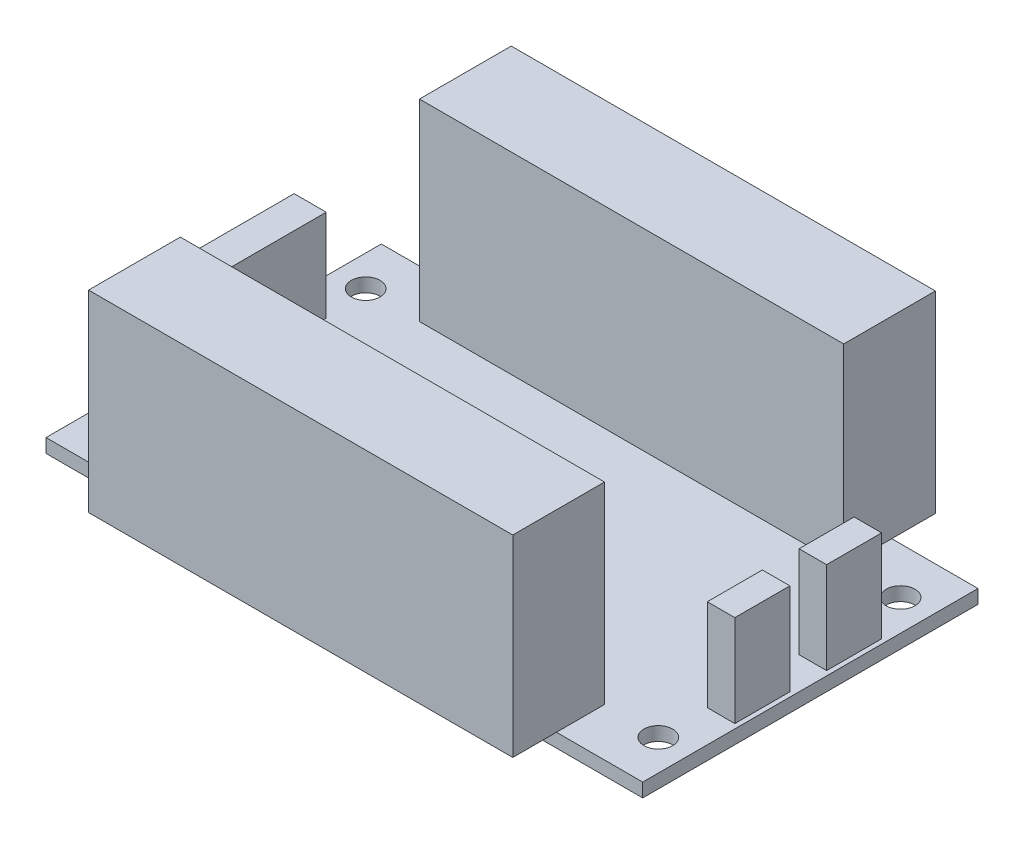
ISO-10303-21;
HEADER;
FILE_DESCRIPTION(('STEP AP214'),'2;1');
FILE_NAME('part.step','',(''),(''),'','','');
FILE_SCHEMA(('AUTOMOTIVE_DESIGN { 1 0 10303 214 1 1 1 1 }'));
ENDSEC;
DATA;
#1=APPLICATION_CONTEXT('core data for automotive mechanical design processes');
#2=APPLICATION_PROTOCOL_DEFINITION('international standard','automotive_design',2000,#1);
#3=PRODUCT_CONTEXT('',#1,'mechanical');
#4=PRODUCT('Part','Part','',(#3));
#5=PRODUCT_RELATED_PRODUCT_CATEGORY('part','',(#4));
#6=PRODUCT_DEFINITION_FORMATION('','',#4);
#7=PRODUCT_DEFINITION_CONTEXT('part definition',#1,'design');
#8=PRODUCT_DEFINITION('design','',#6,#7);
#9=PRODUCT_DEFINITION_SHAPE('','',#8);
#10=(LENGTH_UNIT() NAMED_UNIT(*) SI_UNIT(.MILLI.,.METRE.));
#11=(NAMED_UNIT(*) PLANE_ANGLE_UNIT() SI_UNIT($,.RADIAN.));
#12=(NAMED_UNIT(*) SI_UNIT($,.STERADIAN.) SOLID_ANGLE_UNIT());
#13=UNCERTAINTY_MEASURE_WITH_UNIT(LENGTH_MEASURE(1.E-05),#10,'distance_accuracy_value','');
#14=(GEOMETRIC_REPRESENTATION_CONTEXT(3) GLOBAL_UNCERTAINTY_ASSIGNED_CONTEXT((#13)) GLOBAL_UNIT_ASSIGNED_CONTEXT((#10,
#11,#12)) REPRESENTATION_CONTEXT('',''));
#15=CARTESIAN_POINT('',(0.,0.,0.));
#16=DIRECTION('',(0.,0.,1.));
#17=DIRECTION('',(1.,0.,0.));
#18=AXIS2_PLACEMENT_3D('',#15,#16,#17);
#19=CARTESIAN_POINT('',(0.,1.5,0.));
#20=DIRECTION('',(0.,-1.,0.));
#21=DIRECTION('',(0.,0.,-1.));
#22=AXIS2_PLACEMENT_3D('',#19,#20,#21);
#23=PLANE('',#22);
#24=DIRECTION('',(0.,0.,1.));
#25=VECTOR('',#24,1.);
#26=CARTESIAN_POINT('',(29.015,1.5,-8.27));
#27=LINE('',#26,#25);
#28=CARTESIAN_POINT('',(29.015,1.5,-8.27));
#29=VERTEX_POINT('',#28);
#30=CARTESIAN_POINT('',(29.015,1.5,-2.27));
#31=VERTEX_POINT('',#30);
#32=EDGE_CURVE('E300',#29,#31,#27,.T.);
#33=ORIENTED_EDGE('',*,*,#32,.F.);
#34=DIRECTION('',(-1.,0.,0.));
#35=VECTOR('',#34,1.);
#36=CARTESIAN_POINT('',(32.015,1.5,-8.27000000000008));
#37=LINE('',#36,#35);
#38=CARTESIAN_POINT('',(32.015,1.5,-8.27000000000008));
#39=VERTEX_POINT('',#38);
#40=EDGE_CURVE('E305',#39,#29,#37,.T.);
#41=ORIENTED_EDGE('',*,*,#40,.F.);
#42=DIRECTION('',(0.,0.,-1.));
#43=VECTOR('',#42,1.);
#44=CARTESIAN_POINT('',(32.015,1.5,-8.27000000000008));
#45=LINE('',#44,#43);
#46=CARTESIAN_POINT('',(32.015,1.5,-2.27000000000008));
#47=VERTEX_POINT('',#46);
#48=EDGE_CURVE('E317',#47,#39,#45,.T.);
#49=ORIENTED_EDGE('',*,*,#48,.F.);
#50=DIRECTION('',(1.,0.,0.));
#51=VECTOR('',#50,1.);
#52=CARTESIAN_POINT('',(32.015,1.5,-2.27000000000008));
#53=LINE('',#52,#51);
#54=EDGE_CURVE('E314',#31,#47,#53,.T.);
#55=ORIENTED_EDGE('',*,*,#54,.F.);
#56=EDGE_LOOP('',(#33,#41,#49,#55));
#57=FACE_BOUND('',#56,.T.);
#58=CARTESIAN_POINT('',(-29.145,1.5,13.2));
#59=DIRECTION('',(0.,1.,0.));
#60=DIRECTION('',(0.,0.,-1.));
#61=AXIS2_PLACEMENT_3D('',#58,#59,#60);
#62=CIRCLE('',#61,1.57);
#63=CARTESIAN_POINT('',(-29.145,1.5,11.63));
#64=VERTEX_POINT('',#63);
#65=EDGE_CURVE('E367',#64,#64,#62,.T.);
#66=ORIENTED_EDGE('',*,*,#65,.F.);
#67=EDGE_LOOP('',(#66));
#68=FACE_BOUND('',#67,.T.);
#69=CARTESIAN_POINT('',(29.145,1.5,13.2));
#70=DIRECTION('',(0.,1.,0.));
#71=DIRECTION('',(0.,0.,1.));
#72=AXIS2_PLACEMENT_3D('',#69,#70,#71);
#73=CIRCLE('',#72,1.57);
#74=CARTESIAN_POINT('',(29.145,1.5,14.77));
#75=VERTEX_POINT('',#74);
#76=EDGE_CURVE('E373',#75,#75,#73,.T.);
#77=ORIENTED_EDGE('',*,*,#76,.F.);
#78=EDGE_LOOP('',(#77));
#79=FACE_BOUND('',#78,.T.);
#80=CARTESIAN_POINT('',(29.145,1.5,-13.2));
#81=DIRECTION('',(0.,1.,0.));
#82=DIRECTION('',(0.,0.,-1.));
#83=AXIS2_PLACEMENT_3D('',#80,#81,#82);
#84=CIRCLE('',#83,1.57);
#85=CARTESIAN_POINT('',(29.145,1.5,-14.77));
#86=VERTEX_POINT('',#85);
#87=EDGE_CURVE('E379',#86,#86,#84,.T.);
#88=ORIENTED_EDGE('',*,*,#87,.F.);
#89=EDGE_LOOP('',(#88));
#90=FACE_BOUND('',#89,.T.);
#91=CARTESIAN_POINT('',(-29.145,1.5,-13.2));
#92=DIRECTION('',(0.,1.,0.));
#93=DIRECTION('',(0.,0.,1.));
#94=AXIS2_PLACEMENT_3D('',#91,#92,#93);
#95=CIRCLE('',#94,1.57);
#96=CARTESIAN_POINT('',(-29.145,1.5,-11.63));
#97=VERTEX_POINT('',#96);
#98=EDGE_CURVE('E385',#97,#97,#95,.T.);
#99=ORIENTED_EDGE('',*,*,#98,.F.);
#100=EDGE_LOOP('',(#99));
#101=FACE_BOUND('',#100,.T.);
#102=DIRECTION('',(-1.,0.,0.));
#103=VECTOR('',#102,1.);
#104=CARTESIAN_POINT('',(-32.015,1.5,-8.26999999999999));
#105=LINE('',#104,#103);
#106=CARTESIAN_POINT('',(-28.515,1.5,-8.27));
#107=VERTEX_POINT('',#106);
#108=CARTESIAN_POINT('',(-32.015,1.5,-8.26999999999999));
#109=VERTEX_POINT('',#108);
#110=EDGE_CURVE('E333',#107,#109,#105,.T.);
#111=ORIENTED_EDGE('',*,*,#110,.F.);
#112=DIRECTION('',(0.,0.,-1.));
#113=VECTOR('',#112,1.);
#114=CARTESIAN_POINT('',(-28.515,1.5,-8.27));
#115=LINE('',#114,#113);
#116=CARTESIAN_POINT('',(-28.515,1.5,7.73));
#117=VERTEX_POINT('',#116);
#118=EDGE_CURVE('E338',#117,#107,#115,.T.);
#119=ORIENTED_EDGE('',*,*,#118,.F.);
#120=DIRECTION('',(1.,0.,0.));
#121=VECTOR('',#120,1.);
#122=CARTESIAN_POINT('',(-28.515,1.5,7.73));
#123=LINE('',#122,#121);
#124=CARTESIAN_POINT('',(-32.015,1.5,7.73000000000001));
#125=VERTEX_POINT('',#124);
#126=EDGE_CURVE('E350',#125,#117,#123,.T.);
#127=ORIENTED_EDGE('',*,*,#126,.F.);
#128=DIRECTION('',(0.,0.,1.));
#129=VECTOR('',#128,1.);
#130=CARTESIAN_POINT('',(-32.015,1.5,7.73000000000001));
#131=LINE('',#130,#129);
#132=EDGE_CURVE('E347',#109,#125,#131,.T.);
#133=ORIENTED_EDGE('',*,*,#132,.F.);
#134=EDGE_LOOP('',(#111,#119,#127,#133));
#135=FACE_BOUND('',#134,.T.);
#136=DIRECTION('',(0.,0.,1.));
#137=VECTOR('',#136,1.);
#138=CARTESIAN_POINT('',(29.015,1.5,1.73));
#139=LINE('',#138,#137);
#140=CARTESIAN_POINT('',(29.015,1.5,1.73));
#141=VERTEX_POINT('',#140);
#142=CARTESIAN_POINT('',(29.015,1.5,7.73));
#143=VERTEX_POINT('',#142);
#144=EDGE_CURVE('E267',#141,#143,#139,.T.);
#145=ORIENTED_EDGE('',*,*,#144,.F.);
#146=DIRECTION('',(-1.,0.,0.));
#147=VECTOR('',#146,1.);
#148=CARTESIAN_POINT('',(32.015,1.5,1.73));
#149=LINE('',#148,#147);
#150=CARTESIAN_POINT('',(32.015,1.5,1.73));
#151=VERTEX_POINT('',#150);
#152=EDGE_CURVE('E272',#151,#141,#149,.T.);
#153=ORIENTED_EDGE('',*,*,#152,.F.);
#154=DIRECTION('',(0.,0.,-1.));
#155=VECTOR('',#154,1.);
#156=CARTESIAN_POINT('',(32.015,1.5,1.73));
#157=LINE('',#156,#155);
#158=CARTESIAN_POINT('',(32.015,1.5,7.73));
#159=VERTEX_POINT('',#158);
#160=EDGE_CURVE('E284',#159,#151,#157,.T.);
#161=ORIENTED_EDGE('',*,*,#160,.F.);
#162=DIRECTION('',(1.,0.,0.));
#163=VECTOR('',#162,1.);
#164=CARTESIAN_POINT('',(29.015,1.5,7.73));
#165=LINE('',#164,#163);
#166=EDGE_CURVE('E281',#143,#159,#165,.T.);
#167=ORIENTED_EDGE('',*,*,#166,.F.);
#168=EDGE_LOOP('',(#145,#153,#161,#167));
#169=FACE_BOUND('',#168,.T.);
#170=DIRECTION('',(0.,0.,-1.));
#171=VECTOR('',#170,1.);
#172=CARTESIAN_POINT('',(23.115,1.5,-13.0309360036888));
#173=LINE('',#172,#171);
#174=CARTESIAN_POINT('',(23.115,1.5,-13.0309360036888));
#175=VERTEX_POINT('',#174);
#176=CARTESIAN_POINT('',(23.115,1.5,-18.27));
#177=VERTEX_POINT('',#176);
#178=EDGE_CURVE('E48',#175,#177,#173,.T.);
#179=ORIENTED_EDGE('',*,*,#178,.F.);
#180=DIRECTION('',(1.,0.,0.));
#181=VECTOR('',#180,1.);
#182=CARTESIAN_POINT('',(-23.115,1.5,-13.0309360036888));
#183=LINE('',#182,#181);
#184=CARTESIAN_POINT('',(-23.115,1.5,-13.0309360036888));
#185=VERTEX_POINT('',#184);
#186=EDGE_CURVE('E53',#185,#175,#183,.T.);
#187=ORIENTED_EDGE('',*,*,#186,.F.);
#188=DIRECTION('',(0.,0.,1.));
#189=VECTOR('',#188,1.);
#190=CARTESIAN_POINT('',(-23.115,1.5,-13.0309360036888));
#191=LINE('',#190,#189);
#192=CARTESIAN_POINT('',(-23.115,1.5,-18.27));
#193=VERTEX_POINT('',#192);
#194=EDGE_CURVE('E500',#193,#185,#191,.T.);
#195=ORIENTED_EDGE('',*,*,#194,.F.);
#196=DIRECTION('',(-1.,0.,0.));
#197=VECTOR('',#196,1.);
#198=CARTESIAN_POINT('',(-32.515,1.5,-18.27));
#199=LINE('',#198,#197);
#200=CARTESIAN_POINT('',(-32.515,1.5,-18.27));
#201=VERTEX_POINT('',#200);
#202=EDGE_CURVE('E394',#193,#201,#199,.T.);
#203=ORIENTED_EDGE('',*,*,#202,.T.);
#204=DIRECTION('',(0.,0.,1.));
#205=VECTOR('',#204,1.);
#206=CARTESIAN_POINT('',(-32.515,1.5,18.27));
#207=LINE('',#206,#205);
#208=CARTESIAN_POINT('',(-32.515,1.5,18.27));
#209=VERTEX_POINT('',#208);
#210=EDGE_CURVE('E398',#201,#209,#207,.T.);
#211=ORIENTED_EDGE('',*,*,#210,.T.);
#212=DIRECTION('',(1.,0.,0.));
#213=VECTOR('',#212,1.);
#214=CARTESIAN_POINT('',(-32.515,1.5,18.27));
#215=LINE('',#214,#213);
#216=CARTESIAN_POINT('',(-23.115,1.5,18.27));
#217=VERTEX_POINT('',#216);
#218=EDGE_CURVE('E402',#209,#217,#215,.T.);
#219=ORIENTED_EDGE('',*,*,#218,.T.);
#220=DIRECTION('',(0.,0.,1.));
#221=VECTOR('',#220,1.);
#222=CARTESIAN_POINT('',(-23.115,1.5,13.0309360036888));
#223=LINE('',#222,#221);
#224=CARTESIAN_POINT('',(-23.115,1.5,13.0309360036888));
#225=VERTEX_POINT('',#224);
#226=EDGE_CURVE('E230',#225,#217,#223,.T.);
#227=ORIENTED_EDGE('',*,*,#226,.F.);
#228=DIRECTION('',(-1.,0.,0.));
#229=VECTOR('',#228,1.);
#230=CARTESIAN_POINT('',(-23.115,1.5,13.0309360036888));
#231=LINE('',#230,#229);
#232=CARTESIAN_POINT('',(23.115,1.5,13.0309360036888));
#233=VERTEX_POINT('',#232);
#234=EDGE_CURVE('E240',#233,#225,#231,.T.);
#235=ORIENTED_EDGE('',*,*,#234,.F.);
#236=DIRECTION('',(0.,0.,-1.));
#237=VECTOR('',#236,1.);
#238=CARTESIAN_POINT('',(23.115,1.5,13.0309360036888));
#239=LINE('',#238,#237);
#240=CARTESIAN_POINT('',(23.115,1.5,18.27));
#241=VERTEX_POINT('',#240);
#242=EDGE_CURVE('E250',#241,#233,#239,.T.);
#243=ORIENTED_EDGE('',*,*,#242,.F.);
#244=CARTESIAN_POINT('',(32.515,1.5,18.27));
#245=VERTEX_POINT('',#244);
#246=EDGE_CURVE('E401',#241,#245,#215,.T.);
#247=ORIENTED_EDGE('',*,*,#246,.T.);
#248=DIRECTION('',(0.,0.,-1.));
#249=VECTOR('',#248,1.);
#250=CARTESIAN_POINT('',(32.515,1.5,18.27));
#251=LINE('',#250,#249);
#252=CARTESIAN_POINT('',(32.515,1.5,-18.27));
#253=VERTEX_POINT('',#252);
#254=EDGE_CURVE('E391',#245,#253,#251,.T.);
#255=ORIENTED_EDGE('',*,*,#254,.T.);
#256=EDGE_CURVE('E396',#253,#177,#199,.T.);
#257=ORIENTED_EDGE('',*,*,#256,.T.);
#258=EDGE_LOOP('',(#179,#187,#195,#203,#211,#219,#227,#235,#243,#247,#255,#257));
#259=FACE_BOUND('',#258,.T.);
#260=ADVANCED_FACE('F33',(#57,#68,#79,#90,#101,#135,#169,#259),#23,.F.);
#261=CARTESIAN_POINT('',(0.,0.,0.));
#262=DIRECTION('',(0.,-1.,0.));
#263=DIRECTION('',(0.,0.,-1.));
#264=AXIS2_PLACEMENT_3D('',#261,#262,#263);
#265=PLANE('',#264);
#266=CARTESIAN_POINT('',(29.145,0.,13.2));
#267=DIRECTION('',(0.,1.,0.));
#268=DIRECTION('',(0.,0.,1.));
#269=AXIS2_PLACEMENT_3D('',#266,#267,#268);
#270=CIRCLE('',#269,1.57);
#271=CARTESIAN_POINT('',(29.145,0.,14.77));
#272=VERTEX_POINT('',#271);
#273=EDGE_CURVE('E370',#272,#272,#270,.T.);
#274=ORIENTED_EDGE('',*,*,#273,.T.);
#275=EDGE_LOOP('',(#274));
#276=FACE_BOUND('',#275,.T.);
#277=CARTESIAN_POINT('',(-29.145,0.,-13.2));
#278=DIRECTION('',(0.,1.,0.));
#279=DIRECTION('',(0.,0.,1.));
#280=AXIS2_PLACEMENT_3D('',#277,#278,#279);
#281=CIRCLE('',#280,1.57);
#282=CARTESIAN_POINT('',(-29.145,0.,-11.63));
#283=VERTEX_POINT('',#282);
#284=EDGE_CURVE('E382',#283,#283,#281,.T.);
#285=ORIENTED_EDGE('',*,*,#284,.T.);
#286=EDGE_LOOP('',(#285));
#287=FACE_BOUND('',#286,.T.);
#288=DIRECTION('',(0.,0.,-1.));
#289=VECTOR('',#288,1.);
#290=CARTESIAN_POINT('',(32.515,0.,18.27));
#291=LINE('',#290,#289);
#292=CARTESIAN_POINT('',(32.515,0.,18.27));
#293=VERTEX_POINT('',#292);
#294=CARTESIAN_POINT('',(32.515,0.,-18.27));
#295=VERTEX_POINT('',#294);
#296=EDGE_CURVE('E388',#293,#295,#291,.T.);
#297=ORIENTED_EDGE('',*,*,#296,.F.);
#298=DIRECTION('',(1.,0.,0.));
#299=VECTOR('',#298,1.);
#300=CARTESIAN_POINT('',(-32.515,0.,18.27));
#301=LINE('',#300,#299);
#302=CARTESIAN_POINT('',(-32.515,0.,18.27));
#303=VERTEX_POINT('',#302);
#304=EDGE_CURVE('E395',#303,#293,#301,.T.);
#305=ORIENTED_EDGE('',*,*,#304,.F.);
#306=DIRECTION('',(0.,0.,1.));
#307=VECTOR('',#306,1.);
#308=CARTESIAN_POINT('',(-32.515,0.,18.27));
#309=LINE('',#308,#307);
#310=CARTESIAN_POINT('',(-32.515,0.,-18.27));
#311=VERTEX_POINT('',#310);
#312=EDGE_CURVE('E411',#311,#303,#309,.T.);
#313=ORIENTED_EDGE('',*,*,#312,.F.);
#314=DIRECTION('',(-1.,0.,0.));
#315=VECTOR('',#314,1.);
#316=CARTESIAN_POINT('',(-32.515,0.,-18.27));
#317=LINE('',#316,#315);
#318=EDGE_CURVE('E409',#295,#311,#317,.T.);
#319=ORIENTED_EDGE('',*,*,#318,.F.);
#320=EDGE_LOOP('',(#297,#305,#313,#319));
#321=FACE_BOUND('',#320,.T.);
#322=CARTESIAN_POINT('',(29.145,0.,-13.2));
#323=DIRECTION('',(0.,1.,0.));
#324=DIRECTION('',(0.,0.,-1.));
#325=AXIS2_PLACEMENT_3D('',#322,#323,#324);
#326=CIRCLE('',#325,1.57);
#327=CARTESIAN_POINT('',(29.145,0.,-14.77));
#328=VERTEX_POINT('',#327);
#329=EDGE_CURVE('E376',#328,#328,#326,.T.);
#330=ORIENTED_EDGE('',*,*,#329,.T.);
#331=EDGE_LOOP('',(#330));
#332=FACE_BOUND('',#331,.T.);
#333=CARTESIAN_POINT('',(-29.145,0.,13.2));
#334=DIRECTION('',(0.,1.,0.));
#335=DIRECTION('',(0.,0.,-1.));
#336=AXIS2_PLACEMENT_3D('',#333,#334,#335);
#337=CIRCLE('',#336,1.57);
#338=CARTESIAN_POINT('',(-29.145,0.,11.63));
#339=VERTEX_POINT('',#338);
#340=EDGE_CURVE('E366',#339,#339,#337,.T.);
#341=ORIENTED_EDGE('',*,*,#340,.T.);
#342=EDGE_LOOP('',(#341));
#343=FACE_BOUND('',#342,.T.);
#344=ADVANCED_FACE('F429',(#276,#287,#321,#332,#343),#265,.T.);
#345=CARTESIAN_POINT('',(32.515,1.5,18.27));
#346=DIRECTION('',(-1.,0.,0.));
#347=DIRECTION('',(0.,0.,1.));
#348=AXIS2_PLACEMENT_3D('',#345,#346,#347);
#349=PLANE('',#348);
#350=ORIENTED_EDGE('',*,*,#296,.T.);
#351=DIRECTION('',(0.,-1.,0.));
#352=VECTOR('',#351,1.);
#353=CARTESIAN_POINT('',(32.515,1.5,-18.27));
#354=LINE('',#353,#352);
#355=EDGE_CURVE('E11',#253,#295,#354,.T.);
#356=ORIENTED_EDGE('',*,*,#355,.F.);
#357=ORIENTED_EDGE('',*,*,#254,.F.);
#358=DIRECTION('',(0.,-1.,0.));
#359=VECTOR('',#358,1.);
#360=CARTESIAN_POINT('',(32.515,1.5,18.27));
#361=LINE('',#360,#359);
#362=EDGE_CURVE('E405',#245,#293,#361,.T.);
#363=ORIENTED_EDGE('',*,*,#362,.T.);
#364=EDGE_LOOP('',(#350,#356,#357,#363));
#365=FACE_BOUND('',#364,.T.);
#366=ADVANCED_FACE('F35',(#365),#349,.F.);
#367=CARTESIAN_POINT('',(-32.515,1.5,-18.27));
#368=DIRECTION('',(0.,0.,1.));
#369=DIRECTION('',(1.,0.,0.));
#370=AXIS2_PLACEMENT_3D('',#367,#368,#369);
#371=PLANE('',#370);
#372=ORIENTED_EDGE('',*,*,#318,.T.);
#373=DIRECTION('',(0.,-1.,0.));
#374=VECTOR('',#373,1.);
#375=CARTESIAN_POINT('',(-32.515,1.5,-18.27));
#376=LINE('',#375,#374);
#377=EDGE_CURVE('E41',#201,#311,#376,.T.);
#378=ORIENTED_EDGE('',*,*,#377,.F.);
#379=ORIENTED_EDGE('',*,*,#202,.F.);
#380=EDGE_CURVE('E399',#177,#193,#199,.T.);
#381=ORIENTED_EDGE('',*,*,#380,.F.);
#382=ORIENTED_EDGE('',*,*,#256,.F.);
#383=ORIENTED_EDGE('',*,*,#355,.T.);
#384=EDGE_LOOP('',(#372,#378,#379,#381,#382,#383));
#385=FACE_BOUND('',#384,.T.);
#386=ADVANCED_FACE('F492',(#385),#371,.F.);
#387=CARTESIAN_POINT('',(-32.515,1.5,18.27));
#388=DIRECTION('',(1.,0.,0.));
#389=DIRECTION('',(0.,0.,-1.));
#390=AXIS2_PLACEMENT_3D('',#387,#388,#389);
#391=PLANE('',#390);
#392=ORIENTED_EDGE('',*,*,#312,.T.);
#393=DIRECTION('',(0.,-1.,0.));
#394=VECTOR('',#393,1.);
#395=CARTESIAN_POINT('',(-32.515,1.5,18.27));
#396=LINE('',#395,#394);
#397=EDGE_CURVE('E416',#209,#303,#396,.T.);
#398=ORIENTED_EDGE('',*,*,#397,.F.);
#399=ORIENTED_EDGE('',*,*,#210,.F.);
#400=ORIENTED_EDGE('',*,*,#377,.T.);
#401=EDGE_LOOP('',(#392,#398,#399,#400));
#402=FACE_BOUND('',#401,.T.);
#403=ADVANCED_FACE('F423',(#402),#391,.F.);
#404=CARTESIAN_POINT('',(-32.515,1.5,18.27));
#405=DIRECTION('',(0.,0.,-1.));
#406=DIRECTION('',(-1.,0.,0.));
#407=AXIS2_PLACEMENT_3D('',#404,#405,#406);
#408=PLANE('',#407);
#409=ORIENTED_EDGE('',*,*,#304,.T.);
#410=ORIENTED_EDGE('',*,*,#362,.F.);
#411=ORIENTED_EDGE('',*,*,#246,.F.);
#412=EDGE_CURVE('E406',#217,#241,#215,.T.);
#413=ORIENTED_EDGE('',*,*,#412,.F.);
#414=ORIENTED_EDGE('',*,*,#218,.F.);
#415=ORIENTED_EDGE('',*,*,#397,.T.);
#416=EDGE_LOOP('',(#409,#410,#411,#413,#414,#415));
#417=FACE_BOUND('',#416,.T.);
#418=ADVANCED_FACE('F433',(#417),#408,.F.);
#419=CARTESIAN_POINT('',(-29.145,1.5,-13.2));
#420=DIRECTION('',(0.,-1.,0.));
#421=DIRECTION('',(0.,0.,-1.));
#422=AXIS2_PLACEMENT_3D('',#419,#420,#421);
#423=CYLINDRICAL_SURFACE('',#422,1.57);
#424=ORIENTED_EDGE('',*,*,#98,.T.);
#425=EDGE_LOOP('',(#424));
#426=FACE_BOUND('',#425,.T.);
#427=ORIENTED_EDGE('',*,*,#284,.F.);
#428=EDGE_LOOP('',(#427));
#429=FACE_BOUND('',#428,.T.);
#430=ADVANCED_FACE('F486',(#426,#429),#423,.F.);
#431=CARTESIAN_POINT('',(29.145,1.5,-13.2));
#432=DIRECTION('',(0.,-1.,0.));
#433=DIRECTION('',(0.,0.,-1.));
#434=AXIS2_PLACEMENT_3D('',#431,#432,#433);
#435=CYLINDRICAL_SURFACE('',#434,1.57);
#436=ORIENTED_EDGE('',*,*,#87,.T.);
#437=EDGE_LOOP('',(#436));
#438=FACE_BOUND('',#437,.T.);
#439=ORIENTED_EDGE('',*,*,#329,.F.);
#440=EDGE_LOOP('',(#439));
#441=FACE_BOUND('',#440,.T.);
#442=ADVANCED_FACE('F755',(#438,#441),#435,.F.);
#443=CARTESIAN_POINT('',(29.145,1.5,13.2));
#444=DIRECTION('',(0.,-1.,0.));
#445=DIRECTION('',(0.,0.,-1.));
#446=AXIS2_PLACEMENT_3D('',#443,#444,#445);
#447=CYLINDRICAL_SURFACE('',#446,1.57);
#448=ORIENTED_EDGE('',*,*,#76,.T.);
#449=EDGE_LOOP('',(#448));
#450=FACE_BOUND('',#449,.T.);
#451=ORIENTED_EDGE('',*,*,#273,.F.);
#452=EDGE_LOOP('',(#451));
#453=FACE_BOUND('',#452,.T.);
#454=ADVANCED_FACE('F746',(#450,#453),#447,.F.);
#455=CARTESIAN_POINT('',(-29.145,1.5,13.2));
#456=DIRECTION('',(0.,-1.,0.));
#457=DIRECTION('',(0.,0.,-1.));
#458=AXIS2_PLACEMENT_3D('',#455,#456,#457);
#459=CYLINDRICAL_SURFACE('',#458,1.57);
#460=ORIENTED_EDGE('',*,*,#65,.T.);
#461=EDGE_LOOP('',(#460));
#462=FACE_BOUND('',#461,.T.);
#463=ORIENTED_EDGE('',*,*,#340,.F.);
#464=EDGE_LOOP('',(#463));
#465=FACE_BOUND('',#464,.T.);
#466=ADVANCED_FACE('F737',(#462,#465),#459,.F.);
#467=CARTESIAN_POINT('',(-32.015,11.5,-8.26999999999999));
#468=DIRECTION('',(0.,0.,1.));
#469=DIRECTION('',(1.,0.,0.));
#470=AXIS2_PLACEMENT_3D('',#467,#468,#469);
#471=PLANE('',#470);
#472=ORIENTED_EDGE('',*,*,#110,.T.);
#473=DIRECTION('',(0.,-1.,0.));
#474=VECTOR('',#473,1.);
#475=CARTESIAN_POINT('',(-32.015,11.5,-8.26999999999999));
#476=LINE('',#475,#474);
#477=CARTESIAN_POINT('',(-32.015,11.5,-8.26999999999999));
#478=VERTEX_POINT('',#477);
#479=EDGE_CURVE('E363',#478,#109,#476,.T.);
#480=ORIENTED_EDGE('',*,*,#479,.F.);
#481=DIRECTION('',(-1.,0.,0.));
#482=VECTOR('',#481,1.);
#483=CARTESIAN_POINT('',(-32.015,11.5,-8.26999999999999));
#484=LINE('',#483,#482);
#485=CARTESIAN_POINT('',(-28.515,11.5,-8.27));
#486=VERTEX_POINT('',#485);
#487=EDGE_CURVE('E334',#486,#478,#484,.T.);
#488=ORIENTED_EDGE('',*,*,#487,.F.);
#489=DIRECTION('',(0.,-1.,0.));
#490=VECTOR('',#489,1.);
#491=CARTESIAN_POINT('',(-28.515,11.5,-8.27));
#492=LINE('',#491,#490);
#493=EDGE_CURVE('E344',#486,#107,#492,.T.);
#494=ORIENTED_EDGE('',*,*,#493,.T.);
#495=EDGE_LOOP('',(#472,#480,#488,#494));
#496=FACE_BOUND('',#495,.T.);
#497=ADVANCED_FACE('F728',(#496),#471,.F.);
#498=CARTESIAN_POINT('',(-32.015,11.5,7.73000000000001));
#499=DIRECTION('',(1.,0.,0.));
#500=DIRECTION('',(0.,0.,-1.));
#501=AXIS2_PLACEMENT_3D('',#498,#499,#500);
#502=PLANE('',#501);
#503=ORIENTED_EDGE('',*,*,#132,.T.);
#504=DIRECTION('',(0.,-1.,0.));
#505=VECTOR('',#504,1.);
#506=CARTESIAN_POINT('',(-32.015,11.5,7.73000000000001));
#507=LINE('',#506,#505);
#508=CARTESIAN_POINT('',(-32.015,11.5,7.73000000000001));
#509=VERTEX_POINT('',#508);
#510=EDGE_CURVE('E360',#509,#125,#507,.T.);
#511=ORIENTED_EDGE('',*,*,#510,.F.);
#512=DIRECTION('',(0.,0.,1.));
#513=VECTOR('',#512,1.);
#514=CARTESIAN_POINT('',(-32.015,11.5,7.73000000000001));
#515=LINE('',#514,#513);
#516=EDGE_CURVE('E337',#478,#509,#515,.T.);
#517=ORIENTED_EDGE('',*,*,#516,.F.);
#518=ORIENTED_EDGE('',*,*,#479,.T.);
#519=EDGE_LOOP('',(#503,#511,#517,#518));
#520=FACE_BOUND('',#519,.T.);
#521=ADVANCED_FACE('F719',(#520),#502,.F.);
#522=CARTESIAN_POINT('',(-28.515,11.5,7.73));
#523=DIRECTION('',(0.,0.,-1.));
#524=DIRECTION('',(-1.,0.,0.));
#525=AXIS2_PLACEMENT_3D('',#522,#523,#524);
#526=PLANE('',#525);
#527=ORIENTED_EDGE('',*,*,#126,.T.);
#528=DIRECTION('',(0.,-1.,0.));
#529=VECTOR('',#528,1.);
#530=CARTESIAN_POINT('',(-28.515,11.5,7.73));
#531=LINE('',#530,#529);
#532=CARTESIAN_POINT('',(-28.515,11.5,7.73));
#533=VERTEX_POINT('',#532);
#534=EDGE_CURVE('E357',#533,#117,#531,.T.);
#535=ORIENTED_EDGE('',*,*,#534,.F.);
#536=DIRECTION('',(1.,0.,0.));
#537=VECTOR('',#536,1.);
#538=CARTESIAN_POINT('',(-28.515,11.5,7.73));
#539=LINE('',#538,#537);
#540=EDGE_CURVE('E340',#509,#533,#539,.T.);
#541=ORIENTED_EDGE('',*,*,#540,.F.);
#542=ORIENTED_EDGE('',*,*,#510,.T.);
#543=EDGE_LOOP('',(#527,#535,#541,#542));
#544=FACE_BOUND('',#543,.T.);
#545=ADVANCED_FACE('F710',(#544),#526,.F.);
#546=CARTESIAN_POINT('',(-28.515,11.5,-8.27));
#547=DIRECTION('',(-1.,0.,0.));
#548=DIRECTION('',(0.,0.,1.));
#549=AXIS2_PLACEMENT_3D('',#546,#547,#548);
#550=PLANE('',#549);
#551=ORIENTED_EDGE('',*,*,#118,.T.);
#552=ORIENTED_EDGE('',*,*,#493,.F.);
#553=DIRECTION('',(0.,0.,-1.));
#554=VECTOR('',#553,1.);
#555=CARTESIAN_POINT('',(-28.515,11.5,-8.27));
#556=LINE('',#555,#554);
#557=EDGE_CURVE('E342',#533,#486,#556,.T.);
#558=ORIENTED_EDGE('',*,*,#557,.F.);
#559=ORIENTED_EDGE('',*,*,#534,.T.);
#560=EDGE_LOOP('',(#551,#552,#558,#559));
#561=FACE_BOUND('',#560,.T.);
#562=ADVANCED_FACE('F701',(#561),#550,.F.);
#563=CARTESIAN_POINT('',(0.,11.5,0.));
#564=DIRECTION('',(0.,-1.,0.));
#565=DIRECTION('',(0.,0.,-1.));
#566=AXIS2_PLACEMENT_3D('',#563,#564,#565);
#567=PLANE('',#566);
#568=ORIENTED_EDGE('',*,*,#487,.T.);
#569=ORIENTED_EDGE('',*,*,#516,.T.);
#570=ORIENTED_EDGE('',*,*,#540,.T.);
#571=ORIENTED_EDGE('',*,*,#557,.T.);
#572=EDGE_LOOP('',(#568,#569,#570,#571));
#573=FACE_BOUND('',#572,.T.);
#574=ADVANCED_FACE('F692',(#573),#567,.F.);
#575=CARTESIAN_POINT('',(29.015,11.5,-8.27));
#576=DIRECTION('',(1.,0.,0.));
#577=DIRECTION('',(0.,0.,-1.));
#578=AXIS2_PLACEMENT_3D('',#575,#576,#577);
#579=PLANE('',#578);
#580=ORIENTED_EDGE('',*,*,#32,.T.);
#581=DIRECTION('',(0.,-1.,0.));
#582=VECTOR('',#581,1.);
#583=CARTESIAN_POINT('',(29.015,11.5,-2.27));
#584=LINE('',#583,#582);
#585=CARTESIAN_POINT('',(29.015,11.5,-2.27));
#586=VERTEX_POINT('',#585);
#587=EDGE_CURVE('E330',#586,#31,#584,.T.);
#588=ORIENTED_EDGE('',*,*,#587,.F.);
#589=DIRECTION('',(0.,0.,1.));
#590=VECTOR('',#589,1.);
#591=CARTESIAN_POINT('',(29.015,11.5,-8.27));
#592=LINE('',#591,#590);
#593=CARTESIAN_POINT('',(29.015,11.5,-8.27));
#594=VERTEX_POINT('',#593);
#595=EDGE_CURVE('E301',#594,#586,#592,.T.);
#596=ORIENTED_EDGE('',*,*,#595,.F.);
#597=DIRECTION('',(0.,-1.,0.));
#598=VECTOR('',#597,1.);
#599=CARTESIAN_POINT('',(29.015,11.5,-8.27));
#600=LINE('',#599,#598);
#601=EDGE_CURVE('E311',#594,#29,#600,.T.);
#602=ORIENTED_EDGE('',*,*,#601,.T.);
#603=EDGE_LOOP('',(#580,#588,#596,#602));
#604=FACE_BOUND('',#603,.T.);
#605=ADVANCED_FACE('F683',(#604),#579,.F.);
#606=CARTESIAN_POINT('',(32.015,11.5,-2.27000000000008));
#607=DIRECTION('',(0.,0.,-1.));
#608=DIRECTION('',(-1.,0.,0.));
#609=AXIS2_PLACEMENT_3D('',#606,#607,#608);
#610=PLANE('',#609);
#611=ORIENTED_EDGE('',*,*,#54,.T.);
#612=DIRECTION('',(0.,-1.,0.));
#613=VECTOR('',#612,1.);
#614=CARTESIAN_POINT('',(32.015,11.5,-2.27000000000008));
#615=LINE('',#614,#613);
#616=CARTESIAN_POINT('',(32.015,11.5,-2.27000000000008));
#617=VERTEX_POINT('',#616);
#618=EDGE_CURVE('E327',#617,#47,#615,.T.);
#619=ORIENTED_EDGE('',*,*,#618,.F.);
#620=DIRECTION('',(1.,0.,0.));
#621=VECTOR('',#620,1.);
#622=CARTESIAN_POINT('',(32.015,11.5,-2.27000000000008));
#623=LINE('',#622,#621);
#624=EDGE_CURVE('E304',#586,#617,#623,.T.);
#625=ORIENTED_EDGE('',*,*,#624,.F.);
#626=ORIENTED_EDGE('',*,*,#587,.T.);
#627=EDGE_LOOP('',(#611,#619,#625,#626));
#628=FACE_BOUND('',#627,.T.);
#629=ADVANCED_FACE('F674',(#628),#610,.F.);
#630=CARTESIAN_POINT('',(32.015,11.5,-8.27000000000008));
#631=DIRECTION('',(-1.,0.,0.));
#632=DIRECTION('',(0.,0.,1.));
#633=AXIS2_PLACEMENT_3D('',#630,#631,#632);
#634=PLANE('',#633);
#635=ORIENTED_EDGE('',*,*,#48,.T.);
#636=DIRECTION('',(0.,-1.,0.));
#637=VECTOR('',#636,1.);
#638=CARTESIAN_POINT('',(32.015,11.5,-8.27000000000008));
#639=LINE('',#638,#637);
#640=CARTESIAN_POINT('',(32.015,11.5,-8.27000000000008));
#641=VERTEX_POINT('',#640);
#642=EDGE_CURVE('E324',#641,#39,#639,.T.);
#643=ORIENTED_EDGE('',*,*,#642,.F.);
#644=DIRECTION('',(0.,0.,-1.));
#645=VECTOR('',#644,1.);
#646=CARTESIAN_POINT('',(32.015,11.5,-8.27000000000008));
#647=LINE('',#646,#645);
#648=EDGE_CURVE('E307',#617,#641,#647,.T.);
#649=ORIENTED_EDGE('',*,*,#648,.F.);
#650=ORIENTED_EDGE('',*,*,#618,.T.);
#651=EDGE_LOOP('',(#635,#643,#649,#650));
#652=FACE_BOUND('',#651,.T.);
#653=ADVANCED_FACE('F665',(#652),#634,.F.);
#654=CARTESIAN_POINT('',(32.015,11.5,-8.27000000000008));
#655=DIRECTION('',(0.,0.,1.));
#656=DIRECTION('',(1.,0.,0.));
#657=AXIS2_PLACEMENT_3D('',#654,#655,#656);
#658=PLANE('',#657);
#659=ORIENTED_EDGE('',*,*,#40,.T.);
#660=ORIENTED_EDGE('',*,*,#601,.F.);
#661=DIRECTION('',(-1.,0.,0.));
#662=VECTOR('',#661,1.);
#663=CARTESIAN_POINT('',(32.015,11.5,-8.27000000000008));
#664=LINE('',#663,#662);
#665=EDGE_CURVE('E309',#641,#594,#664,.T.);
#666=ORIENTED_EDGE('',*,*,#665,.F.);
#667=ORIENTED_EDGE('',*,*,#642,.T.);
#668=EDGE_LOOP('',(#659,#660,#666,#667));
#669=FACE_BOUND('',#668,.T.);
#670=ADVANCED_FACE('F656',(#669),#658,.F.);
#671=CARTESIAN_POINT('',(0.,11.5,0.));
#672=DIRECTION('',(0.,-1.,0.));
#673=DIRECTION('',(0.,0.,-1.));
#674=AXIS2_PLACEMENT_3D('',#671,#672,#673);
#675=PLANE('',#674);
#676=ORIENTED_EDGE('',*,*,#595,.T.);
#677=ORIENTED_EDGE('',*,*,#624,.T.);
#678=ORIENTED_EDGE('',*,*,#648,.T.);
#679=ORIENTED_EDGE('',*,*,#665,.T.);
#680=EDGE_LOOP('',(#676,#677,#678,#679));
#681=FACE_BOUND('',#680,.T.);
#682=ADVANCED_FACE('F647',(#681),#675,.F.);
#683=CARTESIAN_POINT('',(29.015,11.5,1.73));
#684=DIRECTION('',(1.,0.,0.));
#685=DIRECTION('',(0.,0.,-1.));
#686=AXIS2_PLACEMENT_3D('',#683,#684,#685);
#687=PLANE('',#686);
#688=ORIENTED_EDGE('',*,*,#144,.T.);
#689=DIRECTION('',(0.,-1.,0.));
#690=VECTOR('',#689,1.);
#691=CARTESIAN_POINT('',(29.015,11.5,7.73));
#692=LINE('',#691,#690);
#693=CARTESIAN_POINT('',(29.015,11.5,7.73));
#694=VERTEX_POINT('',#693);
#695=EDGE_CURVE('E297',#694,#143,#692,.T.);
#696=ORIENTED_EDGE('',*,*,#695,.F.);
#697=DIRECTION('',(0.,0.,1.));
#698=VECTOR('',#697,1.);
#699=CARTESIAN_POINT('',(29.015,11.5,1.73));
#700=LINE('',#699,#698);
#701=CARTESIAN_POINT('',(29.015,11.5,1.73));
#702=VERTEX_POINT('',#701);
#703=EDGE_CURVE('E268',#702,#694,#700,.T.);
#704=ORIENTED_EDGE('',*,*,#703,.F.);
#705=DIRECTION('',(0.,-1.,0.));
#706=VECTOR('',#705,1.);
#707=CARTESIAN_POINT('',(29.015,11.5,1.73));
#708=LINE('',#707,#706);
#709=EDGE_CURVE('E278',#702,#141,#708,.T.);
#710=ORIENTED_EDGE('',*,*,#709,.T.);
#711=EDGE_LOOP('',(#688,#696,#704,#710));
#712=FACE_BOUND('',#711,.T.);
#713=ADVANCED_FACE('F638',(#712),#687,.F.);
#714=CARTESIAN_POINT('',(29.015,11.5,7.73));
#715=DIRECTION('',(0.,0.,-1.));
#716=DIRECTION('',(-1.,0.,0.));
#717=AXIS2_PLACEMENT_3D('',#714,#715,#716);
#718=PLANE('',#717);
#719=ORIENTED_EDGE('',*,*,#166,.T.);
#720=DIRECTION('',(0.,-1.,0.));
#721=VECTOR('',#720,1.);
#722=CARTESIAN_POINT('',(32.015,11.5,7.73));
#723=LINE('',#722,#721);
#724=CARTESIAN_POINT('',(32.015,11.5,7.73));
#725=VERTEX_POINT('',#724);
#726=EDGE_CURVE('E294',#725,#159,#723,.T.);
#727=ORIENTED_EDGE('',*,*,#726,.F.);
#728=DIRECTION('',(1.,0.,0.));
#729=VECTOR('',#728,1.);
#730=CARTESIAN_POINT('',(29.015,11.5,7.73));
#731=LINE('',#730,#729);
#732=EDGE_CURVE('E271',#694,#725,#731,.T.);
#733=ORIENTED_EDGE('',*,*,#732,.F.);
#734=ORIENTED_EDGE('',*,*,#695,.T.);
#735=EDGE_LOOP('',(#719,#727,#733,#734));
#736=FACE_BOUND('',#735,.T.);
#737=ADVANCED_FACE('F629',(#736),#718,.F.);
#738=CARTESIAN_POINT('',(32.015,11.5,1.73));
#739=DIRECTION('',(-1.,0.,0.));
#740=DIRECTION('',(0.,0.,1.));
#741=AXIS2_PLACEMENT_3D('',#738,#739,#740);
#742=PLANE('',#741);
#743=ORIENTED_EDGE('',*,*,#160,.T.);
#744=DIRECTION('',(0.,-1.,0.));
#745=VECTOR('',#744,1.);
#746=CARTESIAN_POINT('',(32.015,11.5,1.73));
#747=LINE('',#746,#745);
#748=CARTESIAN_POINT('',(32.015,11.5,1.73));
#749=VERTEX_POINT('',#748);
#750=EDGE_CURVE('E291',#749,#151,#747,.T.);
#751=ORIENTED_EDGE('',*,*,#750,.F.);
#752=DIRECTION('',(0.,0.,-1.));
#753=VECTOR('',#752,1.);
#754=CARTESIAN_POINT('',(32.015,11.5,1.73));
#755=LINE('',#754,#753);
#756=EDGE_CURVE('E274',#725,#749,#755,.T.);
#757=ORIENTED_EDGE('',*,*,#756,.F.);
#758=ORIENTED_EDGE('',*,*,#726,.T.);
#759=EDGE_LOOP('',(#743,#751,#757,#758));
#760=FACE_BOUND('',#759,.T.);
#761=ADVANCED_FACE('F620',(#760),#742,.F.);
#762=CARTESIAN_POINT('',(32.015,11.5,1.73));
#763=DIRECTION('',(0.,0.,1.));
#764=DIRECTION('',(1.,0.,0.));
#765=AXIS2_PLACEMENT_3D('',#762,#763,#764);
#766=PLANE('',#765);
#767=ORIENTED_EDGE('',*,*,#152,.T.);
#768=ORIENTED_EDGE('',*,*,#709,.F.);
#769=DIRECTION('',(-1.,0.,0.));
#770=VECTOR('',#769,1.);
#771=CARTESIAN_POINT('',(32.015,11.5,1.73));
#772=LINE('',#771,#770);
#773=EDGE_CURVE('E276',#749,#702,#772,.T.);
#774=ORIENTED_EDGE('',*,*,#773,.F.);
#775=ORIENTED_EDGE('',*,*,#750,.T.);
#776=EDGE_LOOP('',(#767,#768,#774,#775));
#777=FACE_BOUND('',#776,.T.);
#778=ADVANCED_FACE('F611',(#777),#766,.F.);
#779=CARTESIAN_POINT('',(0.,11.5,0.));
#780=DIRECTION('',(0.,1.,0.));
#781=DIRECTION('',(0.,0.,1.));
#782=AXIS2_PLACEMENT_3D('',#779,#780,#781);
#783=PLANE('',#782);
#784=ORIENTED_EDGE('',*,*,#703,.T.);
#785=ORIENTED_EDGE('',*,*,#732,.T.);
#786=ORIENTED_EDGE('',*,*,#756,.T.);
#787=ORIENTED_EDGE('',*,*,#773,.T.);
#788=EDGE_LOOP('',(#784,#785,#786,#787));
#789=FACE_BOUND('',#788,.T.);
#790=ADVANCED_FACE('F599',(#789),#783,.T.);
#791=CARTESIAN_POINT('',(0.,1.5,0.));
#792=DIRECTION('',(0.,1.,0.));
#793=DIRECTION('',(0.,0.,1.));
#794=AXIS2_PLACEMENT_3D('',#791,#792,#793);
#795=PLANE('',#794);
#796=CARTESIAN_POINT('',(-23.115,1.5,23.0309360036888));
#797=VERTEX_POINT('',#796);
#798=EDGE_CURVE('E228',#217,#797,#223,.T.);
#799=ORIENTED_EDGE('',*,*,#798,.F.);
#800=ORIENTED_EDGE('',*,*,#412,.T.);
#801=CARTESIAN_POINT('',(23.115,1.5,23.0309360036888));
#802=VERTEX_POINT('',#801);
#803=EDGE_CURVE('E251',#802,#241,#239,.T.);
#804=ORIENTED_EDGE('',*,*,#803,.F.);
#805=DIRECTION('',(1.,0.,0.));
#806=VECTOR('',#805,1.);
#807=CARTESIAN_POINT('',(-23.115,1.5,23.0309360036888));
#808=LINE('',#807,#806);
#809=EDGE_CURVE('E248',#797,#802,#808,.T.);
#810=ORIENTED_EDGE('',*,*,#809,.F.);
#811=EDGE_LOOP('',(#799,#800,#804,#810));
#812=FACE_BOUND('',#811,.T.);
#813=ADVANCED_FACE('F445',(#812),#795,.F.);
#814=CARTESIAN_POINT('',(-23.115,22.5,13.0309360036888));
#815=DIRECTION('',(1.,0.,0.));
#816=DIRECTION('',(0.,0.,-1.));
#817=AXIS2_PLACEMENT_3D('',#814,#815,#816);
#818=PLANE('',#817);
#819=ORIENTED_EDGE('',*,*,#226,.T.);
#820=ORIENTED_EDGE('',*,*,#798,.T.);
#821=DIRECTION('',(0.,-1.,0.));
#822=VECTOR('',#821,1.);
#823=CARTESIAN_POINT('',(-23.115,22.5,23.0309360036888));
#824=LINE('',#823,#822);
#825=CARTESIAN_POINT('',(-23.115,22.5,23.0309360036888));
#826=VERTEX_POINT('',#825);
#827=EDGE_CURVE('E264',#826,#797,#824,.T.);
#828=ORIENTED_EDGE('',*,*,#827,.F.);
#829=DIRECTION('',(0.,0.,1.));
#830=VECTOR('',#829,1.);
#831=CARTESIAN_POINT('',(-23.115,22.5,13.0309360036888));
#832=LINE('',#831,#830);
#833=CARTESIAN_POINT('',(-23.115,22.5,13.0309360036888));
#834=VERTEX_POINT('',#833);
#835=EDGE_CURVE('E236',#834,#826,#832,.T.);
#836=ORIENTED_EDGE('',*,*,#835,.F.);
#837=DIRECTION('',(0.,-1.,0.));
#838=VECTOR('',#837,1.);
#839=CARTESIAN_POINT('',(-23.115,22.5,13.0309360036888));
#840=LINE('',#839,#838);
#841=EDGE_CURVE('E245',#834,#225,#840,.T.);
#842=ORIENTED_EDGE('',*,*,#841,.T.);
#843=EDGE_LOOP('',(#819,#820,#828,#836,#842));
#844=FACE_BOUND('',#843,.T.);
#845=ADVANCED_FACE('F457',(#844),#818,.F.);
#846=CARTESIAN_POINT('',(-23.115,22.5,23.0309360036888));
#847=DIRECTION('',(0.,0.,-1.));
#848=DIRECTION('',(-1.,0.,0.));
#849=AXIS2_PLACEMENT_3D('',#846,#847,#848);
#850=PLANE('',#849);
#851=ORIENTED_EDGE('',*,*,#809,.T.);
#852=DIRECTION('',(0.,-1.,0.));
#853=VECTOR('',#852,1.);
#854=CARTESIAN_POINT('',(23.115,22.5,23.0309360036888));
#855=LINE('',#854,#853);
#856=CARTESIAN_POINT('',(23.115,22.5,23.0309360036888));
#857=VERTEX_POINT('',#856);
#858=EDGE_CURVE('E261',#857,#802,#855,.T.);
#859=ORIENTED_EDGE('',*,*,#858,.F.);
#860=DIRECTION('',(1.,0.,0.));
#861=VECTOR('',#860,1.);
#862=CARTESIAN_POINT('',(-23.115,22.5,23.0309360036888));
#863=LINE('',#862,#861);
#864=EDGE_CURVE('E239',#826,#857,#863,.T.);
#865=ORIENTED_EDGE('',*,*,#864,.F.);
#866=ORIENTED_EDGE('',*,*,#827,.T.);
#867=EDGE_LOOP('',(#851,#859,#865,#866));
#868=FACE_BOUND('',#867,.T.);
#869=ADVANCED_FACE('F453',(#868),#850,.F.);
#870=CARTESIAN_POINT('',(23.115,22.5,13.0309360036888));
#871=DIRECTION('',(-1.,0.,0.));
#872=DIRECTION('',(0.,0.,1.));
#873=AXIS2_PLACEMENT_3D('',#870,#871,#872);
#874=PLANE('',#873);
#875=ORIENTED_EDGE('',*,*,#803,.T.);
#876=ORIENTED_EDGE('',*,*,#242,.T.);
#877=DIRECTION('',(0.,-1.,0.));
#878=VECTOR('',#877,1.);
#879=CARTESIAN_POINT('',(23.115,22.5,13.0309360036888));
#880=LINE('',#879,#878);
#881=CARTESIAN_POINT('',(23.115,22.5,13.0309360036888));
#882=VERTEX_POINT('',#881);
#883=EDGE_CURVE('E258',#882,#233,#880,.T.);
#884=ORIENTED_EDGE('',*,*,#883,.F.);
#885=DIRECTION('',(0.,0.,-1.));
#886=VECTOR('',#885,1.);
#887=CARTESIAN_POINT('',(23.115,22.5,13.0309360036888));
#888=LINE('',#887,#886);
#889=EDGE_CURVE('E242',#857,#882,#888,.T.);
#890=ORIENTED_EDGE('',*,*,#889,.F.);
#891=ORIENTED_EDGE('',*,*,#858,.T.);
#892=EDGE_LOOP('',(#875,#876,#884,#890,#891));
#893=FACE_BOUND('',#892,.T.);
#894=ADVANCED_FACE('F448',(#893),#874,.F.);
#895=CARTESIAN_POINT('',(-23.115,22.5,13.0309360036888));
#896=DIRECTION('',(0.,0.,1.));
#897=DIRECTION('',(1.,0.,0.));
#898=AXIS2_PLACEMENT_3D('',#895,#896,#897);
#899=PLANE('',#898);
#900=ORIENTED_EDGE('',*,*,#234,.T.);
#901=ORIENTED_EDGE('',*,*,#841,.F.);
#902=DIRECTION('',(-1.,0.,0.));
#903=VECTOR('',#902,1.);
#904=CARTESIAN_POINT('',(-23.115,22.5,13.0309360036888));
#905=LINE('',#904,#903);
#906=EDGE_CURVE('E244',#882,#834,#905,.T.);
#907=ORIENTED_EDGE('',*,*,#906,.F.);
#908=ORIENTED_EDGE('',*,*,#883,.T.);
#909=EDGE_LOOP('',(#900,#901,#907,#908));
#910=FACE_BOUND('',#909,.T.);
#911=ADVANCED_FACE('F460',(#910),#899,.F.);
#912=CARTESIAN_POINT('',(0.,22.5,0.));
#913=DIRECTION('',(0.,1.,0.));
#914=DIRECTION('',(0.,0.,1.));
#915=AXIS2_PLACEMENT_3D('',#912,#913,#914);
#916=PLANE('',#915);
#917=ORIENTED_EDGE('',*,*,#835,.T.);
#918=ORIENTED_EDGE('',*,*,#864,.T.);
#919=ORIENTED_EDGE('',*,*,#889,.T.);
#920=ORIENTED_EDGE('',*,*,#906,.T.);
#921=EDGE_LOOP('',(#917,#918,#919,#920));
#922=FACE_BOUND('',#921,.T.);
#923=ADVANCED_FACE('F463',(#922),#916,.T.);
#924=CARTESIAN_POINT('',(0.,1.5,0.));
#925=DIRECTION('',(0.,1.,0.));
#926=DIRECTION('',(0.,0.,1.));
#927=AXIS2_PLACEMENT_3D('',#924,#925,#926);
#928=PLANE('',#927);
#929=CARTESIAN_POINT('',(23.115,1.5,-23.0309360036888));
#930=VERTEX_POINT('',#929);
#931=EDGE_CURVE('E513',#177,#930,#173,.T.);
#932=ORIENTED_EDGE('',*,*,#931,.F.);
#933=ORIENTED_EDGE('',*,*,#380,.T.);
#934=CARTESIAN_POINT('',(-23.115,1.5,-23.0309360036888));
#935=VERTEX_POINT('',#934);
#936=EDGE_CURVE('E225',#935,#193,#191,.T.);
#937=ORIENTED_EDGE('',*,*,#936,.F.);
#938=DIRECTION('',(-1.,0.,0.));
#939=VECTOR('',#938,1.);
#940=CARTESIAN_POINT('',(-23.115,1.5,-23.0309360036888));
#941=LINE('',#940,#939);
#942=EDGE_CURVE('E502',#930,#935,#941,.T.);
#943=ORIENTED_EDGE('',*,*,#942,.F.);
#944=EDGE_LOOP('',(#932,#933,#937,#943));
#945=FACE_BOUND('',#944,.T.);
#946=ADVANCED_FACE('F465',(#945),#928,.F.);
#947=CARTESIAN_POINT('',(-23.115,22.5,-13.0309360036888));
#948=DIRECTION('',(0.,0.,-1.));
#949=DIRECTION('',(-1.,0.,0.));
#950=AXIS2_PLACEMENT_3D('',#947,#948,#949);
#951=PLANE('',#950);
#952=ORIENTED_EDGE('',*,*,#186,.T.);
#953=DIRECTION('',(0.,-1.,0.));
#954=VECTOR('',#953,1.);
#955=CARTESIAN_POINT('',(23.115,22.5,-13.0309360036888));
#956=LINE('',#955,#954);
#957=CARTESIAN_POINT('',(23.115,22.5,-13.0309360036888));
#958=VERTEX_POINT('',#957);
#959=EDGE_CURVE('E210',#958,#175,#956,.T.);
#960=ORIENTED_EDGE('',*,*,#959,.F.);
#961=DIRECTION('',(1.,0.,0.));
#962=VECTOR('',#961,1.);
#963=CARTESIAN_POINT('',(-23.115,22.5,-13.0309360036888));
#964=LINE('',#963,#962);
#965=CARTESIAN_POINT('',(-23.115,22.5,-13.0309360036888));
#966=VERTEX_POINT('',#965);
#967=EDGE_CURVE('E216',#966,#958,#964,.T.);
#968=ORIENTED_EDGE('',*,*,#967,.F.);
#969=DIRECTION('',(0.,-1.,0.));
#970=VECTOR('',#969,1.);
#971=CARTESIAN_POINT('',(-23.115,22.5,-13.0309360036888));
#972=LINE('',#971,#970);
#973=EDGE_CURVE('E507',#966,#185,#972,.T.);
#974=ORIENTED_EDGE('',*,*,#973,.T.);
#975=EDGE_LOOP('',(#952,#960,#968,#974));
#976=FACE_BOUND('',#975,.T.);
#977=ADVANCED_FACE('F227',(#976),#951,.F.);
#978=CARTESIAN_POINT('',(23.115,22.5,-13.0309360036888));
#979=DIRECTION('',(-1.,0.,0.));
#980=DIRECTION('',(0.,0.,1.));
#981=AXIS2_PLACEMENT_3D('',#978,#979,#980);
#982=PLANE('',#981);
#983=ORIENTED_EDGE('',*,*,#178,.T.);
#984=ORIENTED_EDGE('',*,*,#931,.T.);
#985=DIRECTION('',(0.,-1.,0.));
#986=VECTOR('',#985,1.);
#987=CARTESIAN_POINT('',(23.115,22.5,-23.0309360036888));
#988=LINE('',#987,#986);
#989=CARTESIAN_POINT('',(23.115,22.5,-23.0309360036888));
#990=VERTEX_POINT('',#989);
#991=EDGE_CURVE('E212',#990,#930,#988,.T.);
#992=ORIENTED_EDGE('',*,*,#991,.F.);
#993=DIRECTION('',(0.,0.,-1.));
#994=VECTOR('',#993,1.);
#995=CARTESIAN_POINT('',(23.115,22.5,-13.0309360036888));
#996=LINE('',#995,#994);
#997=EDGE_CURVE('E206',#958,#990,#996,.T.);
#998=ORIENTED_EDGE('',*,*,#997,.F.);
#999=ORIENTED_EDGE('',*,*,#959,.T.);
#1000=EDGE_LOOP('',(#983,#984,#992,#998,#999));
#1001=FACE_BOUND('',#1000,.T.);
#1002=ADVANCED_FACE('F208',(#1001),#982,.F.);
#1003=CARTESIAN_POINT('',(-23.115,22.5,-23.0309360036888));
#1004=DIRECTION('',(0.,0.,1.));
#1005=DIRECTION('',(1.,0.,0.));
#1006=AXIS2_PLACEMENT_3D('',#1003,#1004,#1005);
#1007=PLANE('',#1006);
#1008=ORIENTED_EDGE('',*,*,#942,.T.);
#1009=DIRECTION('',(0.,-1.,0.));
#1010=VECTOR('',#1009,1.);
#1011=CARTESIAN_POINT('',(-23.115,22.5,-23.0309360036888));
#1012=LINE('',#1011,#1010);
#1013=CARTESIAN_POINT('',(-23.115,22.5,-23.0309360036888));
#1014=VERTEX_POINT('',#1013);
#1015=EDGE_CURVE('E232',#1014,#935,#1012,.T.);
#1016=ORIENTED_EDGE('',*,*,#1015,.F.);
#1017=DIRECTION('',(-1.,0.,0.));
#1018=VECTOR('',#1017,1.);
#1019=CARTESIAN_POINT('',(-23.115,22.5,-23.0309360036888));
#1020=LINE('',#1019,#1018);
#1021=EDGE_CURVE('E215',#990,#1014,#1020,.T.);
#1022=ORIENTED_EDGE('',*,*,#1021,.F.);
#1023=ORIENTED_EDGE('',*,*,#991,.T.);
#1024=EDGE_LOOP('',(#1008,#1016,#1022,#1023));
#1025=FACE_BOUND('',#1024,.T.);
#1026=ADVANCED_FACE('F514',(#1025),#1007,.F.);
#1027=CARTESIAN_POINT('',(-23.115,22.5,-13.0309360036888));
#1028=DIRECTION('',(1.,0.,0.));
#1029=DIRECTION('',(0.,0.,-1.));
#1030=AXIS2_PLACEMENT_3D('',#1027,#1028,#1029);
#1031=PLANE('',#1030);
#1032=ORIENTED_EDGE('',*,*,#936,.T.);
#1033=ORIENTED_EDGE('',*,*,#194,.T.);
#1034=ORIENTED_EDGE('',*,*,#973,.F.);
#1035=DIRECTION('',(0.,0.,1.));
#1036=VECTOR('',#1035,1.);
#1037=CARTESIAN_POINT('',(-23.115,22.5,-13.0309360036888));
#1038=LINE('',#1037,#1036);
#1039=EDGE_CURVE('E221',#1014,#966,#1038,.T.);
#1040=ORIENTED_EDGE('',*,*,#1039,.F.);
#1041=ORIENTED_EDGE('',*,*,#1015,.T.);
#1042=EDGE_LOOP('',(#1032,#1033,#1034,#1040,#1041));
#1043=FACE_BOUND('',#1042,.T.);
#1044=ADVANCED_FACE('F510',(#1043),#1031,.F.);
#1045=CARTESIAN_POINT('',(0.,22.5,0.));
#1046=DIRECTION('',(0.,1.,0.));
#1047=DIRECTION('',(0.,0.,1.));
#1048=AXIS2_PLACEMENT_3D('',#1045,#1046,#1047);
#1049=PLANE('',#1048);
#1050=ORIENTED_EDGE('',*,*,#967,.T.);
#1051=ORIENTED_EDGE('',*,*,#997,.T.);
#1052=ORIENTED_EDGE('',*,*,#1021,.T.);
#1053=ORIENTED_EDGE('',*,*,#1039,.T.);
#1054=EDGE_LOOP('',(#1050,#1051,#1052,#1053));
#1055=FACE_BOUND('',#1054,.T.);
#1056=ADVANCED_FACE('F219',(#1055),#1049,.T.);
#1057=CLOSED_SHELL('',(#260,#344,#366,#386,#403,#418,#430,#442,#454,#466,#497,#521,#545,#562,
#574,#605,#629,#653,#670,#682,#713,#737,#761,#778,#790,#813,#845,#869,#894,#911,#923,#946,#977,
#1002,#1026,#1044,#1056));
#1058=MANIFOLD_SOLID_BREP('B2',#1057);
#1059=ADVANCED_BREP_SHAPE_REPRESENTATION('',(#18,#1058),#14);
#1060=SHAPE_DEFINITION_REPRESENTATION(#9,#1059);
ENDSEC;
END-ISO-10303-21;
